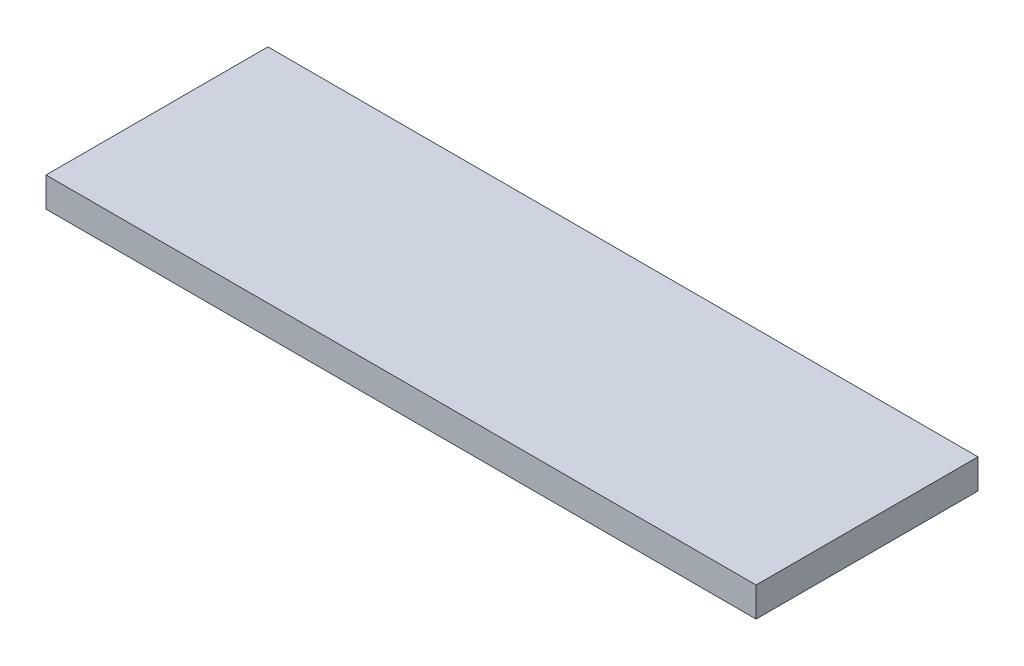
ISO-10303-21;
HEADER;
FILE_DESCRIPTION(('STEP AP214'),'2;1');
FILE_NAME('part.step','',(''),(''),'','','');
FILE_SCHEMA(('AUTOMOTIVE_DESIGN { 1 0 10303 214 1 1 1 1 }'));
ENDSEC;
DATA;
#1=APPLICATION_CONTEXT('core data for automotive mechanical design processes');
#2=APPLICATION_PROTOCOL_DEFINITION('international standard','automotive_design',2000,#1);
#3=PRODUCT_CONTEXT('',#1,'mechanical');
#4=PRODUCT('Part','Part','',(#3));
#5=PRODUCT_RELATED_PRODUCT_CATEGORY('part','',(#4));
#6=PRODUCT_DEFINITION_FORMATION('','',#4);
#7=PRODUCT_DEFINITION_CONTEXT('part definition',#1,'design');
#8=PRODUCT_DEFINITION('design','',#6,#7);
#9=PRODUCT_DEFINITION_SHAPE('','',#8);
#10=(LENGTH_UNIT() NAMED_UNIT(*) SI_UNIT(.MILLI.,.METRE.));
#11=(NAMED_UNIT(*) PLANE_ANGLE_UNIT() SI_UNIT($,.RADIAN.));
#12=(NAMED_UNIT(*) SI_UNIT($,.STERADIAN.) SOLID_ANGLE_UNIT());
#13=UNCERTAINTY_MEASURE_WITH_UNIT(LENGTH_MEASURE(1.E-05),#10,'distance_accuracy_value','');
#14=(GEOMETRIC_REPRESENTATION_CONTEXT(3) GLOBAL_UNCERTAINTY_ASSIGNED_CONTEXT((#13)) GLOBAL_UNIT_ASSIGNED_CONTEXT((#10,
#11,#12)) REPRESENTATION_CONTEXT('',''));
#15=CARTESIAN_POINT('',(0.,0.,0.));
#16=DIRECTION('',(0.,0.,1.));
#17=DIRECTION('',(1.,0.,0.));
#18=AXIS2_PLACEMENT_3D('',#15,#16,#17);
#19=CARTESIAN_POINT('',(0.,4.,0.));
#20=DIRECTION('',(1.,0.,0.));
#21=DIRECTION('',(0.,0.,-1.));
#22=AXIS2_PLACEMENT_3D('',#19,#20,#21);
#23=PLANE('',#22);
#24=DIRECTION('',(0.,0.,1.));
#25=VECTOR('',#24,1.);
#26=CARTESIAN_POINT('',(0.,0.,0.));
#27=LINE('',#26,#25);
#28=CARTESIAN_POINT('',(0.,0.,0.));
#29=VERTEX_POINT('',#28);
#30=CARTESIAN_POINT('',(0.,0.,30.));
#31=VERTEX_POINT('',#30);
#32=EDGE_CURVE('E100',#29,#31,#27,.T.);
#33=ORIENTED_EDGE('',*,*,#32,.T.);
#34=DIRECTION('',(0.,-1.,0.));
#35=VECTOR('',#34,1.);
#36=CARTESIAN_POINT('',(0.,4.,30.));
#37=LINE('',#36,#35);
#38=CARTESIAN_POINT('',(0.,4.,30.));
#39=VERTEX_POINT('',#38);
#40=EDGE_CURVE('E11',#39,#31,#37,.T.);
#41=ORIENTED_EDGE('',*,*,#40,.F.);
#42=DIRECTION('',(0.,0.,1.));
#43=VECTOR('',#42,1.);
#44=CARTESIAN_POINT('',(0.,4.,0.));
#45=LINE('',#44,#43);
#46=CARTESIAN_POINT('',(0.,4.,0.));
#47=VERTEX_POINT('',#46);
#48=EDGE_CURVE('E88',#47,#39,#45,.T.);
#49=ORIENTED_EDGE('',*,*,#48,.F.);
#50=DIRECTION('',(0.,-1.,0.));
#51=VECTOR('',#50,1.);
#52=CARTESIAN_POINT('',(0.,4.,0.));
#53=LINE('',#52,#51);
#54=EDGE_CURVE('E96',#47,#29,#53,.T.);
#55=ORIENTED_EDGE('',*,*,#54,.T.);
#56=EDGE_LOOP('',(#33,#41,#49,#55));
#57=FACE_BOUND('',#56,.T.);
#58=ADVANCED_FACE('F37',(#57),#23,.F.);
#59=CARTESIAN_POINT('',(0.,4.,30.));
#60=DIRECTION('',(0.,0.,-1.));
#61=DIRECTION('',(-1.,0.,0.));
#62=AXIS2_PLACEMENT_3D('',#59,#60,#61);
#63=PLANE('',#62);
#64=DIRECTION('',(1.,0.,0.));
#65=VECTOR('',#64,1.);
#66=CARTESIAN_POINT('',(0.,0.,30.));
#67=LINE('',#66,#65);
#68=CARTESIAN_POINT('',(96.,0.,30.));
#69=VERTEX_POINT('',#68);
#70=EDGE_CURVE('E92',#31,#69,#67,.T.);
#71=ORIENTED_EDGE('',*,*,#70,.T.);
#72=DIRECTION('',(0.,-1.,0.));
#73=VECTOR('',#72,1.);
#74=CARTESIAN_POINT('',(96.,4.,30.));
#75=LINE('',#74,#73);
#76=CARTESIAN_POINT('',(96.,4.,30.));
#77=VERTEX_POINT('',#76);
#78=EDGE_CURVE('E45',#77,#69,#75,.T.);
#79=ORIENTED_EDGE('',*,*,#78,.F.);
#80=DIRECTION('',(1.,0.,0.));
#81=VECTOR('',#80,1.);
#82=CARTESIAN_POINT('',(0.,4.,30.));
#83=LINE('',#82,#81);
#84=EDGE_CURVE('E83',#39,#77,#83,.T.);
#85=ORIENTED_EDGE('',*,*,#84,.F.);
#86=ORIENTED_EDGE('',*,*,#40,.T.);
#87=EDGE_LOOP('',(#71,#79,#85,#86));
#88=FACE_BOUND('',#87,.T.);
#89=ADVANCED_FACE('F91',(#88),#63,.F.);
#90=CARTESIAN_POINT('',(96.,4.,0.));
#91=DIRECTION('',(-1.,0.,0.));
#92=DIRECTION('',(0.,0.,1.));
#93=AXIS2_PLACEMENT_3D('',#90,#91,#92);
#94=PLANE('',#93);
#95=DIRECTION('',(0.,0.,-1.));
#96=VECTOR('',#95,1.);
#97=CARTESIAN_POINT('',(96.,0.,0.));
#98=LINE('',#97,#96);
#99=CARTESIAN_POINT('',(96.,0.,0.));
#100=VERTEX_POINT('',#99);
#101=EDGE_CURVE('E70',#69,#100,#98,.T.);
#102=ORIENTED_EDGE('',*,*,#101,.T.);
#103=DIRECTION('',(0.,-1.,0.));
#104=VECTOR('',#103,1.);
#105=CARTESIAN_POINT('',(96.,4.,0.));
#106=LINE('',#105,#104);
#107=CARTESIAN_POINT('',(96.,4.,0.));
#108=VERTEX_POINT('',#107);
#109=EDGE_CURVE('E93',#108,#100,#106,.T.);
#110=ORIENTED_EDGE('',*,*,#109,.F.);
#111=DIRECTION('',(0.,0.,-1.));
#112=VECTOR('',#111,1.);
#113=CARTESIAN_POINT('',(96.,4.,0.));
#114=LINE('',#113,#112);
#115=EDGE_CURVE('E86',#77,#108,#114,.T.);
#116=ORIENTED_EDGE('',*,*,#115,.F.);
#117=ORIENTED_EDGE('',*,*,#78,.T.);
#118=EDGE_LOOP('',(#102,#110,#116,#117));
#119=FACE_BOUND('',#118,.T.);
#120=ADVANCED_FACE('F94',(#119),#94,.F.);
#121=CARTESIAN_POINT('',(0.,4.,0.));
#122=DIRECTION('',(0.,0.,1.));
#123=DIRECTION('',(1.,0.,0.));
#124=AXIS2_PLACEMENT_3D('',#121,#122,#123);
#125=PLANE('',#124);
#126=DIRECTION('',(-1.,0.,0.));
#127=VECTOR('',#126,1.);
#128=CARTESIAN_POINT('',(0.,0.,0.));
#129=LINE('',#128,#127);
#130=EDGE_CURVE('E76',#100,#29,#129,.T.);
#131=ORIENTED_EDGE('',*,*,#130,.T.);
#132=ORIENTED_EDGE('',*,*,#54,.F.);
#133=DIRECTION('',(-1.,0.,0.));
#134=VECTOR('',#133,1.);
#135=CARTESIAN_POINT('',(0.,4.,0.));
#136=LINE('',#135,#134);
#137=EDGE_CURVE('E53',#108,#47,#136,.T.);
#138=ORIENTED_EDGE('',*,*,#137,.F.);
#139=ORIENTED_EDGE('',*,*,#109,.T.);
#140=EDGE_LOOP('',(#131,#132,#138,#139));
#141=FACE_BOUND('',#140,.T.);
#142=ADVANCED_FACE('F107',(#141),#125,.F.);
#143=CARTESIAN_POINT('',(0.,4.,0.));
#144=DIRECTION('',(0.,1.,0.));
#145=DIRECTION('',(0.,0.,1.));
#146=AXIS2_PLACEMENT_3D('',#143,#144,#145);
#147=PLANE('',#146);
#148=ORIENTED_EDGE('',*,*,#48,.T.);
#149=ORIENTED_EDGE('',*,*,#84,.T.);
#150=ORIENTED_EDGE('',*,*,#115,.T.);
#151=ORIENTED_EDGE('',*,*,#137,.T.);
#152=EDGE_LOOP('',(#148,#149,#150,#151));
#153=FACE_BOUND('',#152,.T.);
#154=ADVANCED_FACE('F84',(#153),#147,.T.);
#155=CARTESIAN_POINT('',(0.,0.,0.));
#156=DIRECTION('',(0.,1.,0.));
#157=DIRECTION('',(0.,0.,1.));
#158=AXIS2_PLACEMENT_3D('',#155,#156,#157);
#159=PLANE('',#158);
#160=ORIENTED_EDGE('',*,*,#32,.F.);
#161=ORIENTED_EDGE('',*,*,#130,.F.);
#162=ORIENTED_EDGE('',*,*,#101,.F.);
#163=ORIENTED_EDGE('',*,*,#70,.F.);
#164=EDGE_LOOP('',(#160,#161,#162,#163));
#165=FACE_BOUND('',#164,.T.);
#166=ADVANCED_FACE('F110',(#165),#159,.F.);
#167=CLOSED_SHELL('',(#58,#89,#120,#142,#154,#166));
#168=MANIFOLD_SOLID_BREP('B2',#167);
#169=ADVANCED_BREP_SHAPE_REPRESENTATION('',(#18,#168),#14);
#170=SHAPE_DEFINITION_REPRESENTATION(#9,#169);
ENDSEC;
END-ISO-10303-21;
